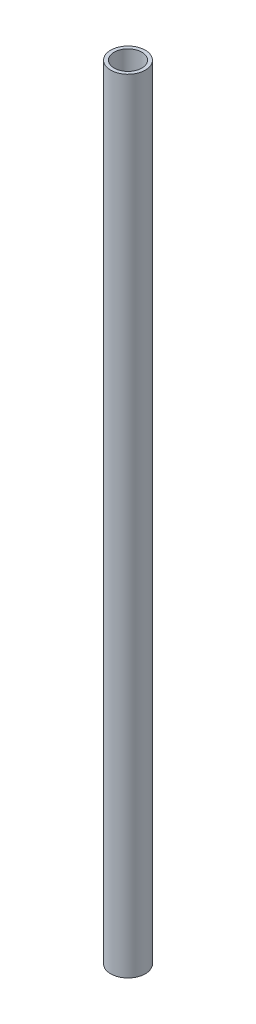
ISO-10303-21;
HEADER;
FILE_DESCRIPTION(('STEP AP214'),'2;1');
FILE_NAME('part.step','',(''),(''),'','','');
FILE_SCHEMA(('AUTOMOTIVE_DESIGN { 1 0 10303 214 1 1 1 1 }'));
ENDSEC;
DATA;
#1=APPLICATION_CONTEXT('core data for automotive mechanical design processes');
#2=APPLICATION_PROTOCOL_DEFINITION('international standard','automotive_design',2000,#1);
#3=PRODUCT_CONTEXT('',#1,'mechanical');
#4=PRODUCT('Part','Part','',(#3));
#5=PRODUCT_RELATED_PRODUCT_CATEGORY('part','',(#4));
#6=PRODUCT_DEFINITION_FORMATION('','',#4);
#7=PRODUCT_DEFINITION_CONTEXT('part definition',#1,'design');
#8=PRODUCT_DEFINITION('design','',#6,#7);
#9=PRODUCT_DEFINITION_SHAPE('','',#8);
#10=(LENGTH_UNIT() NAMED_UNIT(*) SI_UNIT(.MILLI.,.METRE.));
#11=(NAMED_UNIT(*) PLANE_ANGLE_UNIT() SI_UNIT($,.RADIAN.));
#12=(NAMED_UNIT(*) SI_UNIT($,.STERADIAN.) SOLID_ANGLE_UNIT());
#13=UNCERTAINTY_MEASURE_WITH_UNIT(LENGTH_MEASURE(1.E-05),#10,'distance_accuracy_value','');
#14=(GEOMETRIC_REPRESENTATION_CONTEXT(3) GLOBAL_UNCERTAINTY_ASSIGNED_CONTEXT((#13)) GLOBAL_UNIT_ASSIGNED_CONTEXT((#10,
#11,#12)) REPRESENTATION_CONTEXT('',''));
#15=CARTESIAN_POINT('',(0.,0.,0.));
#16=DIRECTION('',(0.,0.,1.));
#17=DIRECTION('',(1.,0.,0.));
#18=AXIS2_PLACEMENT_3D('',#15,#16,#17);
#19=CARTESIAN_POINT('',(0.,452.,0.));
#20=DIRECTION('',(0.,1.,0.));
#21=DIRECTION('',(0.,0.,1.));
#22=AXIS2_PLACEMENT_3D('',#19,#20,#21);
#23=PLANE('',#22);
#24=CARTESIAN_POINT('',(0.,452.,0.));
#25=DIRECTION('',(0.,1.,0.));
#26=DIRECTION('',(0.,0.,1.));
#27=AXIS2_PLACEMENT_3D('',#24,#25,#26);
#28=CIRCLE('',#27,10.);
#29=CARTESIAN_POINT('',(0.,452.,10.));
#30=VERTEX_POINT('',#29);
#31=EDGE_CURVE('E10',#30,#30,#28,.T.);
#32=ORIENTED_EDGE('',*,*,#31,.T.);
#33=EDGE_LOOP('',(#32));
#34=FACE_BOUND('',#33,.T.);
#35=CARTESIAN_POINT('',(0.,452.,0.));
#36=DIRECTION('',(0.,1.,0.));
#37=DIRECTION('',(0.,0.,1.));
#38=AXIS2_PLACEMENT_3D('',#35,#36,#37);
#39=CIRCLE('',#38,8.);
#40=CARTESIAN_POINT('',(0.,452.,8.));
#41=VERTEX_POINT('',#40);
#42=EDGE_CURVE('E48',#41,#41,#39,.T.);
#43=ORIENTED_EDGE('',*,*,#42,.F.);
#44=EDGE_LOOP('',(#43));
#45=FACE_BOUND('',#44,.T.);
#46=ADVANCED_FACE('F34',(#34,#45),#23,.T.);
#47=CARTESIAN_POINT('',(0.,0.,0.));
#48=DIRECTION('',(0.,1.,0.));
#49=DIRECTION('',(0.,0.,1.));
#50=AXIS2_PLACEMENT_3D('',#47,#48,#49);
#51=PLANE('',#50);
#52=CARTESIAN_POINT('',(0.,0.,0.));
#53=DIRECTION('',(0.,1.,0.));
#54=DIRECTION('',(0.,0.,1.));
#55=AXIS2_PLACEMENT_3D('',#52,#53,#54);
#56=CIRCLE('',#55,10.);
#57=CARTESIAN_POINT('',(0.,0.,10.));
#58=VERTEX_POINT('',#57);
#59=EDGE_CURVE('E38',#58,#58,#56,.T.);
#60=ORIENTED_EDGE('',*,*,#59,.F.);
#61=EDGE_LOOP('',(#60));
#62=FACE_BOUND('',#61,.T.);
#63=CARTESIAN_POINT('',(0.,0.,0.));
#64=DIRECTION('',(0.,1.,0.));
#65=DIRECTION('',(0.,0.,1.));
#66=AXIS2_PLACEMENT_3D('',#63,#64,#65);
#67=CIRCLE('',#66,8.);
#68=CARTESIAN_POINT('',(0.,0.,8.));
#69=VERTEX_POINT('',#68);
#70=EDGE_CURVE('E50',#69,#69,#67,.T.);
#71=ORIENTED_EDGE('',*,*,#70,.T.);
#72=EDGE_LOOP('',(#71));
#73=FACE_BOUND('',#72,.T.);
#74=ADVANCED_FACE('F61',(#62,#73),#51,.F.);
#75=CARTESIAN_POINT('',(0.,452.,0.));
#76=DIRECTION('',(0.,-1.,0.));
#77=DIRECTION('',(0.,0.,-1.));
#78=AXIS2_PLACEMENT_3D('',#75,#76,#77);
#79=CYLINDRICAL_SURFACE('',#78,10.);
#80=ORIENTED_EDGE('',*,*,#31,.F.);
#81=EDGE_LOOP('',(#80));
#82=FACE_BOUND('',#81,.T.);
#83=ORIENTED_EDGE('',*,*,#59,.T.);
#84=EDGE_LOOP('',(#83));
#85=FACE_BOUND('',#84,.T.);
#86=ADVANCED_FACE('F36',(#82,#85),#79,.T.);
#87=CARTESIAN_POINT('',(0.,452.,0.));
#88=DIRECTION('',(0.,-1.,0.));
#89=DIRECTION('',(0.,0.,-1.));
#90=AXIS2_PLACEMENT_3D('',#87,#88,#89);
#91=CYLINDRICAL_SURFACE('',#90,8.);
#92=ORIENTED_EDGE('',*,*,#42,.T.);
#93=EDGE_LOOP('',(#92));
#94=FACE_BOUND('',#93,.T.);
#95=ORIENTED_EDGE('',*,*,#70,.F.);
#96=EDGE_LOOP('',(#95));
#97=FACE_BOUND('',#96,.T.);
#98=ADVANCED_FACE('F57',(#94,#97),#91,.F.);
#99=CLOSED_SHELL('',(#46,#74,#86,#98));
#100=MANIFOLD_SOLID_BREP('B2',#99);
#101=ADVANCED_BREP_SHAPE_REPRESENTATION('',(#18,#100),#14);
#102=SHAPE_DEFINITION_REPRESENTATION(#9,#101);
ENDSEC;
END-ISO-10303-21;
